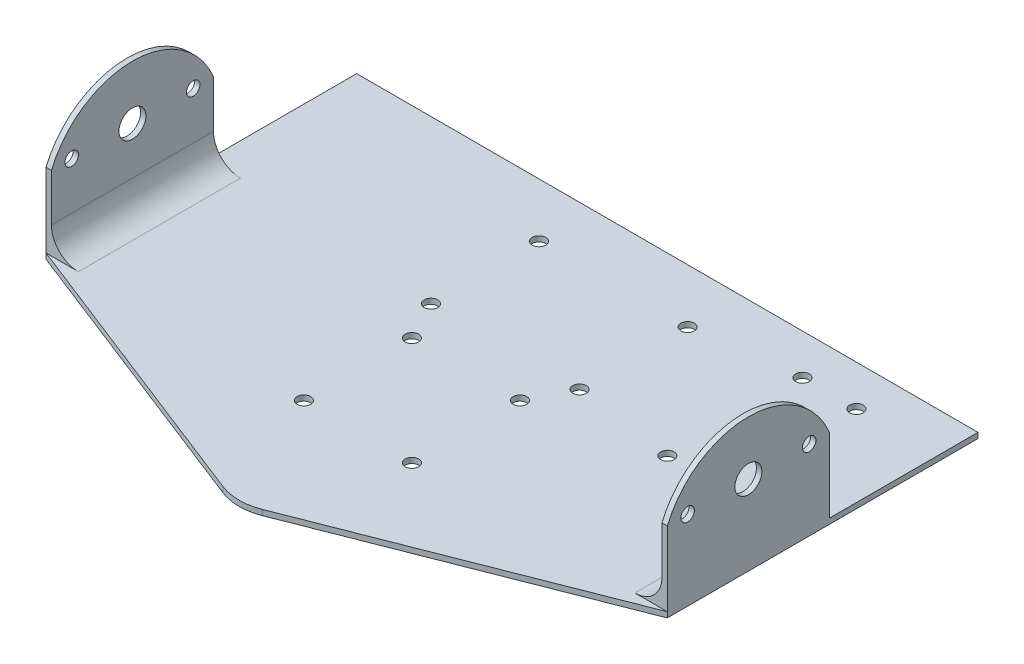
ISO-10303-21;
HEADER;
FILE_DESCRIPTION(('STEP AP214'),'2;1');
FILE_NAME('part.step','',(''),(''),'','','');
FILE_SCHEMA(('AUTOMOTIVE_DESIGN { 1 0 10303 214 1 1 1 1 }'));
ENDSEC;
DATA;
#1=APPLICATION_CONTEXT('core data for automotive mechanical design processes');
#2=APPLICATION_PROTOCOL_DEFINITION('international standard','automotive_design',2000,#1);
#3=PRODUCT_CONTEXT('',#1,'mechanical');
#4=PRODUCT('Part','Part','',(#3));
#5=PRODUCT_RELATED_PRODUCT_CATEGORY('part','',(#4));
#6=PRODUCT_DEFINITION_FORMATION('','',#4);
#7=PRODUCT_DEFINITION_CONTEXT('part definition',#1,'design');
#8=PRODUCT_DEFINITION('design','',#6,#7);
#9=PRODUCT_DEFINITION_SHAPE('','',#8);
#10=(LENGTH_UNIT() NAMED_UNIT(*) SI_UNIT(.MILLI.,.METRE.));
#11=(NAMED_UNIT(*) PLANE_ANGLE_UNIT() SI_UNIT($,.RADIAN.));
#12=(NAMED_UNIT(*) SI_UNIT($,.STERADIAN.) SOLID_ANGLE_UNIT());
#13=UNCERTAINTY_MEASURE_WITH_UNIT(LENGTH_MEASURE(1.E-05),#10,'distance_accuracy_value','');
#14=(GEOMETRIC_REPRESENTATION_CONTEXT(3) GLOBAL_UNCERTAINTY_ASSIGNED_CONTEXT((#13)) GLOBAL_UNIT_ASSIGNED_CONTEXT((#10,
#11,#12)) REPRESENTATION_CONTEXT('',''));
#15=CARTESIAN_POINT('',(0.,0.,0.));
#16=DIRECTION('',(0.,0.,1.));
#17=DIRECTION('',(1.,0.,0.));
#18=AXIS2_PLACEMENT_3D('',#15,#16,#17);
#19=CARTESIAN_POINT('',(0.,2.,0.));
#20=DIRECTION('',(0.,-1.,0.));
#21=DIRECTION('',(0.,0.,-1.));
#22=AXIS2_PLACEMENT_3D('',#19,#20,#21);
#23=PLANE('',#22);
#24=CARTESIAN_POINT('',(-27.5,2.,-25.));
#25=DIRECTION('',(0.,1.,0.));
#26=DIRECTION('',(0.,0.,1.));
#27=AXIS2_PLACEMENT_3D('',#24,#25,#26);
#28=CIRCLE('',#27,2.5);
#29=CARTESIAN_POINT('',(-27.5,2.,-22.5));
#30=VERTEX_POINT('',#29);
#31=EDGE_CURVE('E261',#30,#30,#28,.T.);
#32=ORIENTED_EDGE('',*,*,#31,.F.);
#33=EDGE_LOOP('',(#32));
#34=FACE_BOUND('',#33,.T.);
#35=CARTESIAN_POINT('',(-27.5,2.,-65.));
#36=DIRECTION('',(0.,1.,0.));
#37=DIRECTION('',(0.,0.,1.));
#38=AXIS2_PLACEMENT_3D('',#35,#36,#37);
#39=CIRCLE('',#38,2.5);
#40=CARTESIAN_POINT('',(-27.5,2.,-62.5));
#41=VERTEX_POINT('',#40);
#42=EDGE_CURVE('E257',#41,#41,#39,.T.);
#43=ORIENTED_EDGE('',*,*,#42,.F.);
#44=EDGE_LOOP('',(#43));
#45=FACE_BOUND('',#44,.T.);
#46=CARTESIAN_POINT('',(27.5,2.,-65.));
#47=DIRECTION('',(0.,1.,0.));
#48=DIRECTION('',(0.,0.,1.));
#49=AXIS2_PLACEMENT_3D('',#46,#47,#48);
#50=CIRCLE('',#49,2.5);
#51=CARTESIAN_POINT('',(27.5,2.,-62.5));
#52=VERTEX_POINT('',#51);
#53=EDGE_CURVE('E253',#52,#52,#50,.T.);
#54=ORIENTED_EDGE('',*,*,#53,.F.);
#55=EDGE_LOOP('',(#54));
#56=FACE_BOUND('',#55,.T.);
#57=CARTESIAN_POINT('',(27.5,2.,-25.));
#58=DIRECTION('',(0.,1.,0.));
#59=DIRECTION('',(0.,0.,1.));
#60=AXIS2_PLACEMENT_3D('',#57,#58,#59);
#61=CIRCLE('',#60,2.5);
#62=CARTESIAN_POINT('',(27.5,2.,-22.5));
#63=VERTEX_POINT('',#62);
#64=EDGE_CURVE('E249',#63,#63,#61,.T.);
#65=ORIENTED_EDGE('',*,*,#64,.F.);
#66=EDGE_LOOP('',(#65));
#67=FACE_BOUND('',#66,.T.);
#68=CARTESIAN_POINT('',(85.,2.,-70.));
#69=DIRECTION('',(0.,1.,0.));
#70=DIRECTION('',(0.,0.,1.));
#71=AXIS2_PLACEMENT_3D('',#68,#69,#70);
#72=CIRCLE('',#71,2.50000000000001);
#73=CARTESIAN_POINT('',(85.,2.,-67.5));
#74=VERTEX_POINT('',#73);
#75=EDGE_CURVE('E245',#74,#74,#72,.T.);
#76=ORIENTED_EDGE('',*,*,#75,.F.);
#77=EDGE_LOOP('',(#76));
#78=FACE_BOUND('',#77,.T.);
#79=CARTESIAN_POINT('',(65.,2.,-70.));
#80=DIRECTION('',(0.,1.,0.));
#81=DIRECTION('',(0.,0.,1.));
#82=AXIS2_PLACEMENT_3D('',#79,#80,#81);
#83=CIRCLE('',#82,2.5);
#84=CARTESIAN_POINT('',(65.,2.,-67.5));
#85=VERTEX_POINT('',#84);
#86=EDGE_CURVE('E241',#85,#85,#83,.T.);
#87=ORIENTED_EDGE('',*,*,#86,.F.);
#88=EDGE_LOOP('',(#87));
#89=FACE_BOUND('',#88,.T.);
#90=CARTESIAN_POINT('',(65.,2.,-20.));
#91=DIRECTION('',(0.,1.,0.));
#92=DIRECTION('',(0.,0.,-1.));
#93=AXIS2_PLACEMENT_3D('',#90,#91,#92);
#94=CIRCLE('',#93,2.5);
#95=CARTESIAN_POINT('',(65.,2.,-22.5));
#96=VERTEX_POINT('',#95);
#97=EDGE_CURVE('E237',#96,#96,#94,.T.);
#98=ORIENTED_EDGE('',*,*,#97,.F.);
#99=EDGE_LOOP('',(#98));
#100=FACE_BOUND('',#99,.T.);
#101=CARTESIAN_POINT('',(85.,2.,-20.));
#102=DIRECTION('',(0.,1.,0.));
#103=DIRECTION('',(0.,0.,-1.));
#104=AXIS2_PLACEMENT_3D('',#101,#102,#103);
#105=CIRCLE('',#104,2.50000000000001);
#106=CARTESIAN_POINT('',(85.,2.,-22.5));
#107=VERTEX_POINT('',#106);
#108=EDGE_CURVE('E233',#107,#107,#105,.T.);
#109=ORIENTED_EDGE('',*,*,#108,.F.);
#110=EDGE_LOOP('',(#109));
#111=FACE_BOUND('',#110,.T.);
#112=CARTESIAN_POINT('',(-20.,2.,-10.45));
#113=DIRECTION('',(0.,1.,0.));
#114=DIRECTION('',(0.,0.,1.));
#115=AXIS2_PLACEMENT_3D('',#112,#113,#114);
#116=CIRCLE('',#115,2.5);
#117=CARTESIAN_POINT('',(-20.,2.,-7.95000000000003));
#118=VERTEX_POINT('',#117);
#119=EDGE_CURVE('E229',#118,#118,#116,.T.);
#120=ORIENTED_EDGE('',*,*,#119,.F.);
#121=EDGE_LOOP('',(#120));
#122=FACE_BOUND('',#121,.T.);
#123=CARTESIAN_POINT('',(20.,2.,-10.45));
#124=DIRECTION('',(0.,1.,0.));
#125=DIRECTION('',(0.,0.,1.));
#126=AXIS2_PLACEMENT_3D('',#123,#124,#125);
#127=CIRCLE('',#126,2.5);
#128=CARTESIAN_POINT('',(20.,2.,-7.95000000000003));
#129=VERTEX_POINT('',#128);
#130=EDGE_CURVE('E225',#129,#129,#127,.T.);
#131=ORIENTED_EDGE('',*,*,#130,.F.);
#132=EDGE_LOOP('',(#131));
#133=FACE_BOUND('',#132,.T.);
#134=CARTESIAN_POINT('',(-20.,2.,29.55));
#135=DIRECTION('',(0.,1.,0.));
#136=DIRECTION('',(0.,0.,1.));
#137=AXIS2_PLACEMENT_3D('',#134,#135,#136);
#138=CIRCLE('',#137,2.5);
#139=CARTESIAN_POINT('',(-20.,2.,32.05));
#140=VERTEX_POINT('',#139);
#141=EDGE_CURVE('E221',#140,#140,#138,.T.);
#142=ORIENTED_EDGE('',*,*,#141,.F.);
#143=EDGE_LOOP('',(#142));
#144=FACE_BOUND('',#143,.T.);
#145=CARTESIAN_POINT('',(20.,2.,29.55));
#146=DIRECTION('',(0.,1.,0.));
#147=DIRECTION('',(0.,0.,-1.));
#148=AXIS2_PLACEMENT_3D('',#145,#146,#147);
#149=CIRCLE('',#148,2.5);
#150=CARTESIAN_POINT('',(20.,2.,27.05));
#151=VERTEX_POINT('',#150);
#152=EDGE_CURVE('E217',#151,#151,#149,.T.);
#153=ORIENTED_EDGE('',*,*,#152,.F.);
#154=EDGE_LOOP('',(#153));
#155=FACE_BOUND('',#154,.T.);
#156=DIRECTION('',(1.,0.,0.));
#157=VECTOR('',#156,1.);
#158=CARTESIAN_POINT('',(113.,2.,30.));
#159=LINE('',#158,#157);
#160=CARTESIAN_POINT('',(103.,2.,30.0000000000001));
#161=VERTEX_POINT('',#160);
#162=CARTESIAN_POINT('',(115.,2.,30.));
#163=VERTEX_POINT('',#162);
#164=EDGE_CURVE('E153',#161,#163,#159,.T.);
#165=ORIENTED_EDGE('',*,*,#164,.F.);
#166=DIRECTION('',(0.,0.,-1.));
#167=VECTOR('',#166,1.);
#168=CARTESIAN_POINT('',(103.,2.,30.0000000000001));
#169=LINE('',#168,#167);
#170=CARTESIAN_POINT('',(103.,2.,-30.));
#171=VERTEX_POINT('',#170);
#172=EDGE_CURVE('E159',#161,#171,#169,.T.);
#173=ORIENTED_EDGE('',*,*,#172,.T.);
#174=DIRECTION('',(-1.,0.,0.));
#175=VECTOR('',#174,1.);
#176=CARTESIAN_POINT('',(113.,2.,-30.));
#177=LINE('',#176,#175);
#178=CARTESIAN_POINT('',(115.,2.,-30.));
#179=VERTEX_POINT('',#178);
#180=EDGE_CURVE('E141',#179,#171,#177,.T.);
#181=ORIENTED_EDGE('',*,*,#180,.F.);
#182=DIRECTION('',(0.,0.,-1.));
#183=VECTOR('',#182,1.);
#184=CARTESIAN_POINT('',(115.,2.,50.));
#185=LINE('',#184,#183);
#186=CARTESIAN_POINT('',(115.,2.,-85.));
#187=VERTEX_POINT('',#186);
#188=EDGE_CURVE('E376',#179,#187,#185,.T.);
#189=ORIENTED_EDGE('',*,*,#188,.T.);
#190=DIRECTION('',(-1.,0.,0.));
#191=VECTOR('',#190,1.);
#192=CARTESIAN_POINT('',(0.,2.,-85.));
#193=LINE('',#192,#191);
#194=CARTESIAN_POINT('',(-115.,2.,-84.9999999999999));
#195=VERTEX_POINT('',#194);
#196=EDGE_CURVE('E213',#187,#195,#193,.T.);
#197=ORIENTED_EDGE('',*,*,#196,.T.);
#198=DIRECTION('',(0.,0.,1.));
#199=VECTOR('',#198,1.);
#200=CARTESIAN_POINT('',(-115.,2.,75.));
#201=LINE('',#200,#199);
#202=CARTESIAN_POINT('',(-115.,2.,-30.));
#203=VERTEX_POINT('',#202);
#204=EDGE_CURVE('E370',#195,#203,#201,.T.);
#205=ORIENTED_EDGE('',*,*,#204,.T.);
#206=DIRECTION('',(-1.,0.,0.));
#207=VECTOR('',#206,1.);
#208=CARTESIAN_POINT('',(-113.,2.,-30.));
#209=LINE('',#208,#207);
#210=CARTESIAN_POINT('',(-103.,2.,-30.));
#211=VERTEX_POINT('',#210);
#212=EDGE_CURVE('E55',#211,#203,#209,.T.);
#213=ORIENTED_EDGE('',*,*,#212,.F.);
#214=DIRECTION('',(0.,0.,-1.));
#215=VECTOR('',#214,1.);
#216=CARTESIAN_POINT('',(-103.,1.99999999999878,30.0000000000001));
#217=LINE('',#216,#215);
#218=CARTESIAN_POINT('',(-103.,1.99999999999939,30.0000000000001));
#219=VERTEX_POINT('',#218);
#220=EDGE_CURVE('E175',#219,#211,#217,.T.);
#221=ORIENTED_EDGE('',*,*,#220,.F.);
#222=DIRECTION('',(1.,0.,0.));
#223=VECTOR('',#222,1.);
#224=CARTESIAN_POINT('',(-113.,2.,30.));
#225=LINE('',#224,#223);
#226=CARTESIAN_POINT('',(-115.,2.,30.0000000000001));
#227=VERTEX_POINT('',#226);
#228=EDGE_CURVE('E48',#227,#219,#225,.T.);
#229=ORIENTED_EDGE('',*,*,#228,.F.);
#230=DIRECTION('',(0.931242779705754,0.,0.364399348580512));
#231=VECTOR('',#230,1.);
#232=CARTESIAN_POINT('',(-25.4508196721311,2.,65.0409836065574));
#233=LINE('',#232,#231);
#234=CARTESIAN_POINT('',(-7.28798697161031,2.,72.148179011109));
#235=VERTEX_POINT('',#234);
#236=EDGE_CURVE('E198',#227,#235,#233,.T.);
#237=ORIENTED_EDGE('',*,*,#236,.T.);
#238=CARTESIAN_POINT('',(0.,2.,53.523323416994));
#239=DIRECTION('',(0.,-1.,0.));
#240=DIRECTION('',(0.,0.,-1.));
#241=AXIS2_PLACEMENT_3D('',#238,#239,#240);
#242=CIRCLE('',#241,20.);
#243=CARTESIAN_POINT('',(7.2879869716103,2.,72.148179011109));
#244=VERTEX_POINT('',#243);
#245=EDGE_CURVE('E207',#235,#244,#242,.F.);
#246=ORIENTED_EDGE('',*,*,#245,.T.);
#247=DIRECTION('',(0.931242779705754,0.,-0.364399348580512));
#248=VECTOR('',#247,1.);
#249=CARTESIAN_POINT('',(25.4508196721311,2.,65.0409836065574));
#250=LINE('',#249,#248);
#251=EDGE_CURVE('E205',#244,#163,#250,.T.);
#252=ORIENTED_EDGE('',*,*,#251,.T.);
#253=EDGE_LOOP('',(#165,#173,#181,#189,#197,#205,#213,#221,#229,#237,#246,#252));
#254=FACE_BOUND('',#253,.T.);
#255=ADVANCED_FACE('F33',(#34,#45,#56,#67,#78,#89,#100,#111,#122,#133,#144,#155,#254),#23,.F.);
#256=CARTESIAN_POINT('',(113.,57.,30.));
#257=DIRECTION('',(1.,0.,0.));
#258=DIRECTION('',(0.,0.,-1.));
#259=AXIS2_PLACEMENT_3D('',#256,#257,#258);
#260=PLANE('',#259);
#261=CARTESIAN_POINT('',(113.,29.5,0.));
#262=DIRECTION('',(1.,0.,0.));
#263=DIRECTION('',(0.,0.,-1.));
#264=AXIS2_PLACEMENT_3D('',#261,#262,#263);
#265=CIRCLE('',#264,5.);
#266=CARTESIAN_POINT('',(113.,29.5,-5.00000000000002));
#267=VERTEX_POINT('',#266);
#268=EDGE_CURVE('E306',#267,#267,#265,.T.);
#269=ORIENTED_EDGE('',*,*,#268,.T.);
#270=EDGE_LOOP('',(#269));
#271=FACE_BOUND('',#270,.T.);
#272=CARTESIAN_POINT('',(113.,29.5,-22.5));
#273=DIRECTION('',(1.,0.,0.));
#274=DIRECTION('',(0.,0.,-1.));
#275=AXIS2_PLACEMENT_3D('',#272,#273,#274);
#276=CIRCLE('',#275,2.5);
#277=CARTESIAN_POINT('',(113.,29.5,-25.));
#278=VERTEX_POINT('',#277);
#279=EDGE_CURVE('E296',#278,#278,#276,.T.);
#280=ORIENTED_EDGE('',*,*,#279,.T.);
#281=EDGE_LOOP('',(#280));
#282=FACE_BOUND('',#281,.T.);
#283=CARTESIAN_POINT('',(113.,29.5,22.5));
#284=DIRECTION('',(1.,0.,0.));
#285=DIRECTION('',(0.,0.,-1.));
#286=AXIS2_PLACEMENT_3D('',#283,#284,#285);
#287=CIRCLE('',#286,2.5);
#288=CARTESIAN_POINT('',(113.,29.5,20.));
#289=VERTEX_POINT('',#288);
#290=EDGE_CURVE('E286',#289,#289,#287,.T.);
#291=ORIENTED_EDGE('',*,*,#290,.T.);
#292=EDGE_LOOP('',(#291));
#293=FACE_BOUND('',#292,.T.);
#294=DIRECTION('',(0.,0.,-1.));
#295=VECTOR('',#294,1.);
#296=CARTESIAN_POINT('',(113.,12.0000000000001,30.0000000000001));
#297=LINE('',#296,#295);
#298=CARTESIAN_POINT('',(113.,12.0000000000001,30.0000000000001));
#299=VERTEX_POINT('',#298);
#300=CARTESIAN_POINT('',(113.,12.0000000000001,-30.));
#301=VERTEX_POINT('',#300);
#302=EDGE_CURVE('E161',#299,#301,#297,.T.);
#303=ORIENTED_EDGE('',*,*,#302,.F.);
#304=DIRECTION('',(0.,-1.,0.));
#305=VECTOR('',#304,1.);
#306=CARTESIAN_POINT('',(113.,57.,30.));
#307=LINE('',#306,#305);
#308=CARTESIAN_POINT('',(113.,29.5,30.));
#309=VERTEX_POINT('',#308);
#310=EDGE_CURVE('E317',#309,#299,#307,.T.);
#311=ORIENTED_EDGE('',*,*,#310,.F.);
#312=CARTESIAN_POINT('',(113.,17.,0.));
#313=DIRECTION('',(1.,0.,0.));
#314=DIRECTION('',(0.,0.,-1.));
#315=AXIS2_PLACEMENT_3D('',#312,#313,#314);
#316=CIRCLE('',#315,32.5);
#317=CARTESIAN_POINT('',(113.,29.5,-30.));
#318=VERTEX_POINT('',#317);
#319=EDGE_CURVE('E268',#309,#318,#316,.F.);
#320=ORIENTED_EDGE('',*,*,#319,.T.);
#321=DIRECTION('',(0.,-1.,0.));
#322=VECTOR('',#321,1.);
#323=CARTESIAN_POINT('',(113.,57.,-30.));
#324=LINE('',#323,#322);
#325=EDGE_CURVE('E320',#318,#301,#324,.T.);
#326=ORIENTED_EDGE('',*,*,#325,.T.);
#327=EDGE_LOOP('',(#303,#311,#320,#326));
#328=FACE_BOUND('',#327,.T.);
#329=ADVANCED_FACE('F395',(#271,#282,#293,#328),#260,.F.);
#330=CARTESIAN_POINT('',(-113.,57.,30.));
#331=DIRECTION('',(-1.,0.,0.));
#332=DIRECTION('',(0.,0.,1.));
#333=AXIS2_PLACEMENT_3D('',#330,#331,#332);
#334=PLANE('',#333);
#335=CARTESIAN_POINT('',(-113.,29.5,0.));
#336=DIRECTION('',(-1.,0.,0.));
#337=DIRECTION('',(0.,0.,1.));
#338=AXIS2_PLACEMENT_3D('',#335,#336,#337);
#339=CIRCLE('',#338,5.);
#340=CARTESIAN_POINT('',(-113.,29.5,5.00000000000002));
#341=VERTEX_POINT('',#340);
#342=EDGE_CURVE('E307',#341,#341,#339,.T.);
#343=ORIENTED_EDGE('',*,*,#342,.T.);
#344=EDGE_LOOP('',(#343));
#345=FACE_BOUND('',#344,.T.);
#346=CARTESIAN_POINT('',(-113.,29.5,-22.5));
#347=DIRECTION('',(-1.,0.,0.));
#348=DIRECTION('',(0.,0.,1.));
#349=AXIS2_PLACEMENT_3D('',#346,#347,#348);
#350=CIRCLE('',#349,2.5);
#351=CARTESIAN_POINT('',(-113.,29.5,-20.));
#352=VERTEX_POINT('',#351);
#353=EDGE_CURVE('E297',#352,#352,#350,.T.);
#354=ORIENTED_EDGE('',*,*,#353,.T.);
#355=EDGE_LOOP('',(#354));
#356=FACE_BOUND('',#355,.T.);
#357=CARTESIAN_POINT('',(-113.,29.5,22.5));
#358=DIRECTION('',(-1.,0.,0.));
#359=DIRECTION('',(0.,0.,1.));
#360=AXIS2_PLACEMENT_3D('',#357,#358,#359);
#361=CIRCLE('',#360,2.5);
#362=CARTESIAN_POINT('',(-113.,29.5,25.));
#363=VERTEX_POINT('',#362);
#364=EDGE_CURVE('E287',#363,#363,#361,.T.);
#365=ORIENTED_EDGE('',*,*,#364,.T.);
#366=EDGE_LOOP('',(#365));
#367=FACE_BOUND('',#366,.T.);
#368=DIRECTION('',(0.,0.,-1.));
#369=VECTOR('',#368,1.);
#370=CARTESIAN_POINT('',(-113.,11.9999999999987,30.0000000000001));
#371=LINE('',#370,#369);
#372=CARTESIAN_POINT('',(-113.,11.9999999999987,30.));
#373=VERTEX_POINT('',#372);
#374=CARTESIAN_POINT('',(-113.,11.9999999999987,-30.));
#375=VERTEX_POINT('',#374);
#376=EDGE_CURVE('E178',#373,#375,#371,.T.);
#377=ORIENTED_EDGE('',*,*,#376,.T.);
#378=DIRECTION('',(0.,-1.,0.));
#379=VECTOR('',#378,1.);
#380=CARTESIAN_POINT('',(-113.,57.,-30.));
#381=LINE('',#380,#379);
#382=CARTESIAN_POINT('',(-113.,29.5,-30.));
#383=VERTEX_POINT('',#382);
#384=EDGE_CURVE('E339',#383,#375,#381,.T.);
#385=ORIENTED_EDGE('',*,*,#384,.F.);
#386=CARTESIAN_POINT('',(-113.,17.,0.));
#387=DIRECTION('',(-1.,0.,0.));
#388=DIRECTION('',(0.,0.,1.));
#389=AXIS2_PLACEMENT_3D('',#386,#387,#388);
#390=CIRCLE('',#389,32.5);
#391=CARTESIAN_POINT('',(-113.,29.5,30.));
#392=VERTEX_POINT('',#391);
#393=EDGE_CURVE('E274',#383,#392,#390,.F.);
#394=ORIENTED_EDGE('',*,*,#393,.T.);
#395=DIRECTION('',(0.,-1.,0.));
#396=VECTOR('',#395,1.);
#397=CARTESIAN_POINT('',(-113.,57.,30.));
#398=LINE('',#397,#396);
#399=EDGE_CURVE('E324',#392,#373,#398,.T.);
#400=ORIENTED_EDGE('',*,*,#399,.T.);
#401=EDGE_LOOP('',(#377,#385,#394,#400));
#402=FACE_BOUND('',#401,.T.);
#403=ADVANCED_FACE('F409',(#345,#356,#367,#402),#334,.F.);
#404=CARTESIAN_POINT('',(115.,2.,-50.));
#405=DIRECTION('',(-1.,0.,0.));
#406=DIRECTION('',(0.,0.,1.));
#407=AXIS2_PLACEMENT_3D('',#404,#405,#406);
#408=PLANE('',#407);
#409=CARTESIAN_POINT('',(115.,29.5,22.5));
#410=DIRECTION('',(-1.,0.,0.));
#411=DIRECTION('',(0.,0.,1.));
#412=AXIS2_PLACEMENT_3D('',#409,#410,#411);
#413=CIRCLE('',#412,2.5);
#414=CARTESIAN_POINT('',(115.,29.5,25.));
#415=VERTEX_POINT('',#414);
#416=EDGE_CURVE('E290',#415,#415,#413,.T.);
#417=ORIENTED_EDGE('',*,*,#416,.T.);
#418=EDGE_LOOP('',(#417));
#419=FACE_BOUND('',#418,.T.);
#420=CARTESIAN_POINT('',(115.,29.5,-22.5));
#421=DIRECTION('',(-1.,0.,0.));
#422=DIRECTION('',(0.,0.,1.));
#423=AXIS2_PLACEMENT_3D('',#420,#421,#422);
#424=CIRCLE('',#423,2.5);
#425=CARTESIAN_POINT('',(115.,29.5,-20.));
#426=VERTEX_POINT('',#425);
#427=EDGE_CURVE('E300',#426,#426,#424,.T.);
#428=ORIENTED_EDGE('',*,*,#427,.T.);
#429=EDGE_LOOP('',(#428));
#430=FACE_BOUND('',#429,.T.);
#431=CARTESIAN_POINT('',(115.,29.5,0.));
#432=DIRECTION('',(-1.,0.,0.));
#433=DIRECTION('',(0.,0.,1.));
#434=AXIS2_PLACEMENT_3D('',#431,#432,#433);
#435=CIRCLE('',#434,5.);
#436=CARTESIAN_POINT('',(115.,29.5,4.99999999999999));
#437=VERTEX_POINT('',#436);
#438=EDGE_CURVE('E154',#437,#437,#435,.T.);
#439=ORIENTED_EDGE('',*,*,#438,.T.);
#440=EDGE_LOOP('',(#439));
#441=FACE_BOUND('',#440,.T.);
#442=DIRECTION('',(0.,-1.,0.));
#443=VECTOR('',#442,1.);
#444=CARTESIAN_POINT('',(115.,57.,30.));
#445=LINE('',#444,#443);
#446=CARTESIAN_POINT('',(115.,29.5,30.));
#447=VERTEX_POINT('',#446);
#448=EDGE_CURVE('E314',#447,#163,#445,.T.);
#449=ORIENTED_EDGE('',*,*,#448,.T.);
#450=DIRECTION('',(0.,-1.,0.));
#451=VECTOR('',#450,1.);
#452=CARTESIAN_POINT('',(115.,357.647053358393,30.));
#453=LINE('',#452,#451);
#454=CARTESIAN_POINT('',(115.,1.11022302462516E-13,30.));
#455=VERTEX_POINT('',#454);
#456=EDGE_CURVE('E182',#163,#455,#453,.T.);
#457=ORIENTED_EDGE('',*,*,#456,.T.);
#458=DIRECTION('',(0.,0.,-1.));
#459=VECTOR('',#458,1.);
#460=CARTESIAN_POINT('',(115.,0.,-50.));
#461=LINE('',#460,#459);
#462=CARTESIAN_POINT('',(115.,0.,-85.));
#463=VERTEX_POINT('',#462);
#464=EDGE_CURVE('E371',#455,#463,#461,.T.);
#465=ORIENTED_EDGE('',*,*,#464,.T.);
#466=DIRECTION('',(0.,-1.,0.));
#467=VECTOR('',#466,1.);
#468=CARTESIAN_POINT('',(115.,396.800799701989,-85.));
#469=LINE('',#468,#467);
#470=EDGE_CURVE('E209',#187,#463,#469,.T.);
#471=ORIENTED_EDGE('',*,*,#470,.F.);
#472=ORIENTED_EDGE('',*,*,#188,.F.);
#473=DIRECTION('',(0.,-1.,0.));
#474=VECTOR('',#473,1.);
#475=CARTESIAN_POINT('',(115.,57.,-30.));
#476=LINE('',#475,#474);
#477=CARTESIAN_POINT('',(115.,29.5,-30.));
#478=VERTEX_POINT('',#477);
#479=EDGE_CURVE('E149',#478,#179,#476,.T.);
#480=ORIENTED_EDGE('',*,*,#479,.F.);
#481=CARTESIAN_POINT('',(115.,17.,0.));
#482=DIRECTION('',(-1.,0.,0.));
#483=DIRECTION('',(0.,0.,1.));
#484=AXIS2_PLACEMENT_3D('',#481,#482,#483);
#485=CIRCLE('',#484,32.5);
#486=EDGE_CURVE('E280',#478,#447,#485,.F.);
#487=ORIENTED_EDGE('',*,*,#486,.T.);
#488=EDGE_LOOP('',(#449,#457,#465,#471,#472,#480,#487));
#489=FACE_BOUND('',#488,.T.);
#490=ADVANCED_FACE('F35',(#419,#430,#441,#489),#408,.F.);
#491=CARTESIAN_POINT('',(-115.,2.,-50.));
#492=DIRECTION('',(1.,0.,0.));
#493=DIRECTION('',(0.,0.,-1.));
#494=AXIS2_PLACEMENT_3D('',#491,#492,#493);
#495=PLANE('',#494);
#496=CARTESIAN_POINT('',(-115.,29.5,22.5));
#497=DIRECTION('',(-1.,0.,0.));
#498=DIRECTION('',(0.,0.,1.));
#499=AXIS2_PLACEMENT_3D('',#496,#497,#498);
#500=CIRCLE('',#499,2.5);
#501=CARTESIAN_POINT('',(-115.,29.5,25.));
#502=VERTEX_POINT('',#501);
#503=EDGE_CURVE('E283',#502,#502,#500,.T.);
#504=ORIENTED_EDGE('',*,*,#503,.F.);
#505=EDGE_LOOP('',(#504));
#506=FACE_BOUND('',#505,.T.);
#507=CARTESIAN_POINT('',(-115.,29.5,-22.5));
#508=DIRECTION('',(-1.,0.,0.));
#509=DIRECTION('',(0.,0.,1.));
#510=AXIS2_PLACEMENT_3D('',#507,#508,#509);
#511=CIRCLE('',#510,2.5);
#512=CARTESIAN_POINT('',(-115.,29.5,-20.));
#513=VERTEX_POINT('',#512);
#514=EDGE_CURVE('E293',#513,#513,#511,.T.);
#515=ORIENTED_EDGE('',*,*,#514,.F.);
#516=EDGE_LOOP('',(#515));
#517=FACE_BOUND('',#516,.T.);
#518=CARTESIAN_POINT('',(-115.,29.5,0.));
#519=DIRECTION('',(-1.,0.,0.));
#520=DIRECTION('',(0.,0.,1.));
#521=AXIS2_PLACEMENT_3D('',#518,#519,#520);
#522=CIRCLE('',#521,5.);
#523=CARTESIAN_POINT('',(-115.,29.5,5.00000000000002));
#524=VERTEX_POINT('',#523);
#525=EDGE_CURVE('E303',#524,#524,#522,.T.);
#526=ORIENTED_EDGE('',*,*,#525,.F.);
#527=EDGE_LOOP('',(#526));
#528=FACE_BOUND('',#527,.T.);
#529=DIRECTION('',(0.,0.,1.));
#530=VECTOR('',#529,1.);
#531=CARTESIAN_POINT('',(-115.,0.,-50.));
#532=LINE('',#531,#530);
#533=CARTESIAN_POINT('',(-115.,0.,-85.));
#534=VERTEX_POINT('',#533);
#535=CARTESIAN_POINT('',(-115.,0.,30.));
#536=VERTEX_POINT('',#535);
#537=EDGE_CURVE('E367',#534,#536,#532,.T.);
#538=ORIENTED_EDGE('',*,*,#537,.T.);
#539=DIRECTION('',(0.,-1.,0.));
#540=VECTOR('',#539,1.);
#541=CARTESIAN_POINT('',(-115.,357.647053358393,30.));
#542=LINE('',#541,#540);
#543=EDGE_CURVE('E190',#227,#536,#542,.T.);
#544=ORIENTED_EDGE('',*,*,#543,.F.);
#545=DIRECTION('',(0.,-1.,0.));
#546=VECTOR('',#545,1.);
#547=CARTESIAN_POINT('',(-115.,57.,30.));
#548=LINE('',#547,#546);
#549=CARTESIAN_POINT('',(-115.,29.5,30.));
#550=VERTEX_POINT('',#549);
#551=EDGE_CURVE('E340',#550,#227,#548,.T.);
#552=ORIENTED_EDGE('',*,*,#551,.F.);
#553=CARTESIAN_POINT('',(-115.,17.,0.));
#554=DIRECTION('',(1.,0.,0.));
#555=DIRECTION('',(0.,0.,-1.));
#556=AXIS2_PLACEMENT_3D('',#553,#554,#555);
#557=CIRCLE('',#556,32.5);
#558=CARTESIAN_POINT('',(-115.,29.5,-30.));
#559=VERTEX_POINT('',#558);
#560=EDGE_CURVE('E277',#550,#559,#557,.F.);
#561=ORIENTED_EDGE('',*,*,#560,.T.);
#562=DIRECTION('',(0.,-1.,0.));
#563=VECTOR('',#562,1.);
#564=CARTESIAN_POINT('',(-115.,57.,-30.));
#565=LINE('',#564,#563);
#566=EDGE_CURVE('E335',#559,#203,#565,.T.);
#567=ORIENTED_EDGE('',*,*,#566,.T.);
#568=ORIENTED_EDGE('',*,*,#204,.F.);
#569=DIRECTION('',(0.,-1.,0.));
#570=VECTOR('',#569,1.);
#571=CARTESIAN_POINT('',(-115.,396.800799701989,-85.));
#572=LINE('',#571,#570);
#573=EDGE_CURVE('E210',#195,#534,#572,.T.);
#574=ORIENTED_EDGE('',*,*,#573,.T.);
#575=EDGE_LOOP('',(#538,#544,#552,#561,#567,#568,#574));
#576=FACE_BOUND('',#575,.T.);
#577=ADVANCED_FACE('F408',(#506,#517,#528,#576),#495,.F.);
#578=CARTESIAN_POINT('',(0.,0.,0.));
#579=DIRECTION('',(0.,-1.,0.));
#580=DIRECTION('',(0.,0.,-1.));
#581=AXIS2_PLACEMENT_3D('',#578,#579,#580);
#582=PLANE('',#581);
#583=DIRECTION('',(0.931242779705754,0.,0.364399348580512));
#584=VECTOR('',#583,1.);
#585=CARTESIAN_POINT('',(-25.4508196721311,0.,65.0409836065574));
#586=LINE('',#585,#584);
#587=CARTESIAN_POINT('',(-7.28798697161031,0.,72.148179011109));
#588=VERTEX_POINT('',#587);
#589=EDGE_CURVE('E195',#536,#588,#586,.T.);
#590=ORIENTED_EDGE('',*,*,#589,.F.);
#591=ORIENTED_EDGE('',*,*,#537,.F.);
#592=DIRECTION('',(-1.,0.,0.));
#593=VECTOR('',#592,1.);
#594=CARTESIAN_POINT('',(0.,0.,-85.));
#595=LINE('',#594,#593);
#596=EDGE_CURVE('E41',#463,#534,#595,.T.);
#597=ORIENTED_EDGE('',*,*,#596,.F.);
#598=ORIENTED_EDGE('',*,*,#464,.F.);
#599=DIRECTION('',(0.931242779705754,0.,-0.364399348580512));
#600=VECTOR('',#599,1.);
#601=CARTESIAN_POINT('',(25.4508196721311,0.,65.0409836065574));
#602=LINE('',#601,#600);
#603=CARTESIAN_POINT('',(7.2879869716103,0.,72.148179011109));
#604=VERTEX_POINT('',#603);
#605=EDGE_CURVE('E200',#604,#455,#602,.T.);
#606=ORIENTED_EDGE('',*,*,#605,.F.);
#607=CARTESIAN_POINT('',(0.,0.,53.523323416994));
#608=DIRECTION('',(0.,-1.,0.));
#609=DIRECTION('',(0.,0.,-1.));
#610=AXIS2_PLACEMENT_3D('',#607,#608,#609);
#611=CIRCLE('',#610,20.);
#612=EDGE_CURVE('E11',#588,#604,#611,.F.);
#613=ORIENTED_EDGE('',*,*,#612,.F.);
#614=EDGE_LOOP('',(#590,#591,#597,#598,#606,#613));
#615=FACE_BOUND('',#614,.T.);
#616=CARTESIAN_POINT('',(20.,0.,29.55));
#617=DIRECTION('',(0.,-1.,0.));
#618=DIRECTION('',(0.,0.,-1.));
#619=AXIS2_PLACEMENT_3D('',#616,#617,#618);
#620=CIRCLE('',#619,2.5);
#621=CARTESIAN_POINT('',(20.,0.,27.05));
#622=VERTEX_POINT('',#621);
#623=EDGE_CURVE('E220',#622,#622,#620,.T.);
#624=ORIENTED_EDGE('',*,*,#623,.F.);
#625=EDGE_LOOP('',(#624));
#626=FACE_BOUND('',#625,.T.);
#627=CARTESIAN_POINT('',(-20.,0.,29.55));
#628=DIRECTION('',(0.,-1.,0.));
#629=DIRECTION('',(0.,0.,-1.));
#630=AXIS2_PLACEMENT_3D('',#627,#628,#629);
#631=CIRCLE('',#630,2.5);
#632=CARTESIAN_POINT('',(-20.,0.,27.05));
#633=VERTEX_POINT('',#632);
#634=EDGE_CURVE('E224',#633,#633,#631,.T.);
#635=ORIENTED_EDGE('',*,*,#634,.F.);
#636=EDGE_LOOP('',(#635));
#637=FACE_BOUND('',#636,.T.);
#638=CARTESIAN_POINT('',(20.,0.,-10.45));
#639=DIRECTION('',(0.,-1.,0.));
#640=DIRECTION('',(0.,0.,-1.));
#641=AXIS2_PLACEMENT_3D('',#638,#639,#640);
#642=CIRCLE('',#641,2.5);
#643=CARTESIAN_POINT('',(20.,0.,-12.95));
#644=VERTEX_POINT('',#643);
#645=EDGE_CURVE('E228',#644,#644,#642,.T.);
#646=ORIENTED_EDGE('',*,*,#645,.F.);
#647=EDGE_LOOP('',(#646));
#648=FACE_BOUND('',#647,.T.);
#649=CARTESIAN_POINT('',(-20.,0.,-10.45));
#650=DIRECTION('',(0.,-1.,0.));
#651=DIRECTION('',(0.,0.,-1.));
#652=AXIS2_PLACEMENT_3D('',#649,#650,#651);
#653=CIRCLE('',#652,2.5);
#654=CARTESIAN_POINT('',(-20.,0.,-12.95));
#655=VERTEX_POINT('',#654);
#656=EDGE_CURVE('E232',#655,#655,#653,.T.);
#657=ORIENTED_EDGE('',*,*,#656,.F.);
#658=EDGE_LOOP('',(#657));
#659=FACE_BOUND('',#658,.T.);
#660=CARTESIAN_POINT('',(85.,0.,-20.));
#661=DIRECTION('',(0.,-1.,0.));
#662=DIRECTION('',(0.,0.,-1.));
#663=AXIS2_PLACEMENT_3D('',#660,#661,#662);
#664=CIRCLE('',#663,2.50000000000001);
#665=CARTESIAN_POINT('',(85.,0.,-22.5));
#666=VERTEX_POINT('',#665);
#667=EDGE_CURVE('E236',#666,#666,#664,.T.);
#668=ORIENTED_EDGE('',*,*,#667,.F.);
#669=EDGE_LOOP('',(#668));
#670=FACE_BOUND('',#669,.T.);
#671=CARTESIAN_POINT('',(65.,0.,-20.));
#672=DIRECTION('',(0.,-1.,0.));
#673=DIRECTION('',(0.,0.,-1.));
#674=AXIS2_PLACEMENT_3D('',#671,#672,#673);
#675=CIRCLE('',#674,2.5);
#676=CARTESIAN_POINT('',(65.,0.,-22.5));
#677=VERTEX_POINT('',#676);
#678=EDGE_CURVE('E240',#677,#677,#675,.T.);
#679=ORIENTED_EDGE('',*,*,#678,.F.);
#680=EDGE_LOOP('',(#679));
#681=FACE_BOUND('',#680,.T.);
#682=CARTESIAN_POINT('',(65.,0.,-70.));
#683=DIRECTION('',(0.,-1.,0.));
#684=DIRECTION('',(0.,0.,-1.));
#685=AXIS2_PLACEMENT_3D('',#682,#683,#684);
#686=CIRCLE('',#685,2.5);
#687=CARTESIAN_POINT('',(65.,0.,-72.5));
#688=VERTEX_POINT('',#687);
#689=EDGE_CURVE('E244',#688,#688,#686,.T.);
#690=ORIENTED_EDGE('',*,*,#689,.F.);
#691=EDGE_LOOP('',(#690));
#692=FACE_BOUND('',#691,.T.);
#693=CARTESIAN_POINT('',(85.,0.,-70.));
#694=DIRECTION('',(0.,-1.,0.));
#695=DIRECTION('',(0.,0.,-1.));
#696=AXIS2_PLACEMENT_3D('',#693,#694,#695);
#697=CIRCLE('',#696,2.50000000000001);
#698=CARTESIAN_POINT('',(85.,0.,-72.5));
#699=VERTEX_POINT('',#698);
#700=EDGE_CURVE('E248',#699,#699,#697,.T.);
#701=ORIENTED_EDGE('',*,*,#700,.F.);
#702=EDGE_LOOP('',(#701));
#703=FACE_BOUND('',#702,.T.);
#704=CARTESIAN_POINT('',(27.5,0.,-25.));
#705=DIRECTION('',(0.,-1.,0.));
#706=DIRECTION('',(0.,0.,-1.));
#707=AXIS2_PLACEMENT_3D('',#704,#705,#706);
#708=CIRCLE('',#707,2.5);
#709=CARTESIAN_POINT('',(27.5,0.,-27.5));
#710=VERTEX_POINT('',#709);
#711=EDGE_CURVE('E252',#710,#710,#708,.T.);
#712=ORIENTED_EDGE('',*,*,#711,.F.);
#713=EDGE_LOOP('',(#712));
#714=FACE_BOUND('',#713,.T.);
#715=CARTESIAN_POINT('',(27.5,0.,-65.));
#716=DIRECTION('',(0.,-1.,0.));
#717=DIRECTION('',(0.,0.,-1.));
#718=AXIS2_PLACEMENT_3D('',#715,#716,#717);
#719=CIRCLE('',#718,2.5);
#720=CARTESIAN_POINT('',(27.5,0.,-67.5));
#721=VERTEX_POINT('',#720);
#722=EDGE_CURVE('E256',#721,#721,#719,.T.);
#723=ORIENTED_EDGE('',*,*,#722,.F.);
#724=EDGE_LOOP('',(#723));
#725=FACE_BOUND('',#724,.T.);
#726=CARTESIAN_POINT('',(-27.5,0.,-65.));
#727=DIRECTION('',(0.,-1.,0.));
#728=DIRECTION('',(0.,0.,-1.));
#729=AXIS2_PLACEMENT_3D('',#726,#727,#728);
#730=CIRCLE('',#729,2.5);
#731=CARTESIAN_POINT('',(-27.5,0.,-67.5));
#732=VERTEX_POINT('',#731);
#733=EDGE_CURVE('E260',#732,#732,#730,.T.);
#734=ORIENTED_EDGE('',*,*,#733,.F.);
#735=EDGE_LOOP('',(#734));
#736=FACE_BOUND('',#735,.T.);
#737=CARTESIAN_POINT('',(-27.5,0.,-25.));
#738=DIRECTION('',(0.,-1.,0.));
#739=DIRECTION('',(0.,0.,-1.));
#740=AXIS2_PLACEMENT_3D('',#737,#738,#739);
#741=CIRCLE('',#740,2.5);
#742=CARTESIAN_POINT('',(-27.5,0.,-27.5));
#743=VERTEX_POINT('',#742);
#744=EDGE_CURVE('E264',#743,#743,#741,.T.);
#745=ORIENTED_EDGE('',*,*,#744,.F.);
#746=EDGE_LOOP('',(#745));
#747=FACE_BOUND('',#746,.T.);
#748=ADVANCED_FACE('F417',(#615,#626,#637,#648,#659,#670,#681,#692,#703,#714,#725,#736,#747),
#582,.T.);
#749=CARTESIAN_POINT('',(-113.,57.,-30.));
#750=DIRECTION('',(0.,0.,1.));
#751=DIRECTION('',(1.,0.,0.));
#752=AXIS2_PLACEMENT_3D('',#749,#750,#751);
#753=PLANE('',#752);
#754=ORIENTED_EDGE('',*,*,#566,.F.);
#755=DIRECTION('',(-1.,0.,0.));
#756=VECTOR('',#755,1.);
#757=CARTESIAN_POINT('',(511.96911079062,29.5,-30.));
#758=LINE('',#757,#756);
#759=EDGE_CURVE('E270',#383,#559,#758,.T.);
#760=ORIENTED_EDGE('',*,*,#759,.F.);
#761=ORIENTED_EDGE('',*,*,#384,.T.);
#762=CARTESIAN_POINT('',(-103.,11.9999999999988,-30.));
#763=DIRECTION('',(0.,0.,1.));
#764=DIRECTION('',(1.,0.,0.));
#765=AXIS2_PLACEMENT_3D('',#762,#763,#764);
#766=CIRCLE('',#765,10.);
#767=EDGE_CURVE('E163',#375,#211,#766,.T.);
#768=ORIENTED_EDGE('',*,*,#767,.T.);
#769=ORIENTED_EDGE('',*,*,#212,.T.);
#770=EDGE_LOOP('',(#754,#760,#761,#768,#769));
#771=FACE_BOUND('',#770,.T.);
#772=ADVANCED_FACE('F439',(#771),#753,.F.);
#773=CARTESIAN_POINT('',(-113.,57.,30.));
#774=DIRECTION('',(0.,0.,-1.));
#775=DIRECTION('',(-1.,0.,0.));
#776=AXIS2_PLACEMENT_3D('',#773,#774,#775);
#777=PLANE('',#776);
#778=ORIENTED_EDGE('',*,*,#399,.F.);
#779=DIRECTION('',(-1.,0.,0.));
#780=VECTOR('',#779,1.);
#781=CARTESIAN_POINT('',(511.96911079062,29.5,30.));
#782=LINE('',#781,#780);
#783=EDGE_CURVE('E265',#392,#550,#782,.T.);
#784=ORIENTED_EDGE('',*,*,#783,.T.);
#785=ORIENTED_EDGE('',*,*,#551,.T.);
#786=ORIENTED_EDGE('',*,*,#228,.T.);
#787=CARTESIAN_POINT('',(-103.,11.9999999999988,30.0000000000001));
#788=DIRECTION('',(0.,0.,1.));
#789=DIRECTION('',(1.,0.,0.));
#790=AXIS2_PLACEMENT_3D('',#787,#788,#789);
#791=CIRCLE('',#790,10.);
#792=EDGE_CURVE('E172',#373,#219,#791,.T.);
#793=ORIENTED_EDGE('',*,*,#792,.F.);
#794=EDGE_LOOP('',(#778,#784,#785,#786,#793));
#795=FACE_BOUND('',#794,.T.);
#796=ADVANCED_FACE('F445',(#795),#777,.F.);
#797=CARTESIAN_POINT('',(113.,57.,-30.));
#798=DIRECTION('',(0.,0.,1.));
#799=DIRECTION('',(1.,0.,0.));
#800=AXIS2_PLACEMENT_3D('',#797,#798,#799);
#801=PLANE('',#800);
#802=ORIENTED_EDGE('',*,*,#325,.F.);
#803=EDGE_CURVE('E269',#478,#318,#758,.T.);
#804=ORIENTED_EDGE('',*,*,#803,.F.);
#805=ORIENTED_EDGE('',*,*,#479,.T.);
#806=ORIENTED_EDGE('',*,*,#180,.T.);
#807=CARTESIAN_POINT('',(103.,12.,-30.));
#808=DIRECTION('',(0.,0.,-1.));
#809=DIRECTION('',(-1.,0.,0.));
#810=AXIS2_PLACEMENT_3D('',#807,#808,#809);
#811=CIRCLE('',#810,10.);
#812=EDGE_CURVE('E145',#301,#171,#811,.T.);
#813=ORIENTED_EDGE('',*,*,#812,.F.);
#814=EDGE_LOOP('',(#802,#804,#805,#806,#813));
#815=FACE_BOUND('',#814,.T.);
#816=ADVANCED_FACE('F144',(#815),#801,.F.);
#817=CARTESIAN_POINT('',(113.,57.,30.));
#818=DIRECTION('',(0.,0.,-1.));
#819=DIRECTION('',(-1.,0.,0.));
#820=AXIS2_PLACEMENT_3D('',#817,#818,#819);
#821=PLANE('',#820);
#822=ORIENTED_EDGE('',*,*,#448,.F.);
#823=DIRECTION('',(-1.,0.,0.));
#824=VECTOR('',#823,1.);
#825=CARTESIAN_POINT('',(511.96911079062,29.5,30.));
#826=LINE('',#825,#824);
#827=EDGE_CURVE('E374',#447,#309,#826,.T.);
#828=ORIENTED_EDGE('',*,*,#827,.T.);
#829=ORIENTED_EDGE('',*,*,#310,.T.);
#830=CARTESIAN_POINT('',(103.,12.,30.0000000000001));
#831=DIRECTION('',(0.,0.,-1.));
#832=DIRECTION('',(-1.,0.,0.));
#833=AXIS2_PLACEMENT_3D('',#830,#831,#832);
#834=CIRCLE('',#833,10.);
#835=EDGE_CURVE('E164',#299,#161,#834,.T.);
#836=ORIENTED_EDGE('',*,*,#835,.T.);
#837=ORIENTED_EDGE('',*,*,#164,.T.);
#838=EDGE_LOOP('',(#822,#828,#829,#836,#837));
#839=FACE_BOUND('',#838,.T.);
#840=ADVANCED_FACE('F402',(#839),#821,.F.);
#841=CARTESIAN_POINT('',(168.,29.5,0.));
#842=DIRECTION('',(-1.,0.,0.));
#843=DIRECTION('',(0.,0.,1.));
#844=AXIS2_PLACEMENT_3D('',#841,#842,#843);
#845=CYLINDRICAL_SURFACE('',#844,5.);
#846=ORIENTED_EDGE('',*,*,#268,.F.);
#847=EDGE_LOOP('',(#846));
#848=FACE_BOUND('',#847,.T.);
#849=ORIENTED_EDGE('',*,*,#438,.F.);
#850=EDGE_LOOP('',(#849));
#851=FACE_BOUND('',#850,.T.);
#852=ADVANCED_FACE('F398',(#848,#851),#845,.F.);
#853=ORIENTED_EDGE('',*,*,#525,.T.);
#854=EDGE_LOOP('',(#853));
#855=FACE_BOUND('',#854,.T.);
#856=ORIENTED_EDGE('',*,*,#342,.F.);
#857=EDGE_LOOP('',(#856));
#858=FACE_BOUND('',#857,.T.);
#859=ADVANCED_FACE('F401',(#855,#858),#845,.F.);
#860=CARTESIAN_POINT('',(168.,29.5,-22.5));
#861=DIRECTION('',(-1.,0.,0.));
#862=DIRECTION('',(0.,0.,1.));
#863=AXIS2_PLACEMENT_3D('',#860,#861,#862);
#864=CYLINDRICAL_SURFACE('',#863,2.5);
#865=ORIENTED_EDGE('',*,*,#279,.F.);
#866=EDGE_LOOP('',(#865));
#867=FACE_BOUND('',#866,.T.);
#868=ORIENTED_EDGE('',*,*,#427,.F.);
#869=EDGE_LOOP('',(#868));
#870=FACE_BOUND('',#869,.T.);
#871=ADVANCED_FACE('F478',(#867,#870),#864,.F.);
#872=ORIENTED_EDGE('',*,*,#514,.T.);
#873=EDGE_LOOP('',(#872));
#874=FACE_BOUND('',#873,.T.);
#875=ORIENTED_EDGE('',*,*,#353,.F.);
#876=EDGE_LOOP('',(#875));
#877=FACE_BOUND('',#876,.T.);
#878=ADVANCED_FACE('F483',(#874,#877),#864,.F.);
#879=CARTESIAN_POINT('',(168.,29.5,22.5));
#880=DIRECTION('',(-1.,0.,0.));
#881=DIRECTION('',(0.,0.,1.));
#882=AXIS2_PLACEMENT_3D('',#879,#880,#881);
#883=CYLINDRICAL_SURFACE('',#882,2.5);
#884=ORIENTED_EDGE('',*,*,#290,.F.);
#885=EDGE_LOOP('',(#884));
#886=FACE_BOUND('',#885,.T.);
#887=ORIENTED_EDGE('',*,*,#416,.F.);
#888=EDGE_LOOP('',(#887));
#889=FACE_BOUND('',#888,.T.);
#890=ADVANCED_FACE('F535',(#886,#889),#883,.F.);
#891=ORIENTED_EDGE('',*,*,#503,.T.);
#892=EDGE_LOOP('',(#891));
#893=FACE_BOUND('',#892,.T.);
#894=ORIENTED_EDGE('',*,*,#364,.F.);
#895=EDGE_LOOP('',(#894));
#896=FACE_BOUND('',#895,.T.);
#897=ADVANCED_FACE('F544',(#893,#896),#883,.F.);
#898=CARTESIAN_POINT('',(511.96911079062,17.,0.));
#899=DIRECTION('',(-1.,0.,0.));
#900=DIRECTION('',(0.,0.,1.));
#901=AXIS2_PLACEMENT_3D('',#898,#899,#900);
#902=CYLINDRICAL_SURFACE('',#901,32.5);
#903=ORIENTED_EDGE('',*,*,#486,.F.);
#904=ORIENTED_EDGE('',*,*,#803,.T.);
#905=ORIENTED_EDGE('',*,*,#319,.F.);
#906=ORIENTED_EDGE('',*,*,#827,.F.);
#907=EDGE_LOOP('',(#903,#904,#905,#906));
#908=FACE_BOUND('',#907,.T.);
#909=ADVANCED_FACE('F553',(#908),#902,.T.);
#910=ORIENTED_EDGE('',*,*,#560,.F.);
#911=ORIENTED_EDGE('',*,*,#783,.F.);
#912=ORIENTED_EDGE('',*,*,#393,.F.);
#913=ORIENTED_EDGE('',*,*,#759,.T.);
#914=EDGE_LOOP('',(#910,#911,#912,#913));
#915=FACE_BOUND('',#914,.T.);
#916=ADVANCED_FACE('F447',(#915),#902,.T.);
#917=CARTESIAN_POINT('',(-27.5,-8.,-25.));
#918=DIRECTION('',(0.,1.,0.));
#919=DIRECTION('',(0.,0.,1.));
#920=AXIS2_PLACEMENT_3D('',#917,#918,#919);
#921=CYLINDRICAL_SURFACE('',#920,2.5);
#922=ORIENTED_EDGE('',*,*,#744,.T.);
#923=EDGE_LOOP('',(#922));
#924=FACE_BOUND('',#923,.T.);
#925=ORIENTED_EDGE('',*,*,#31,.T.);
#926=EDGE_LOOP('',(#925));
#927=FACE_BOUND('',#926,.T.);
#928=ADVANCED_FACE('F573',(#924,#927),#921,.F.);
#929=CARTESIAN_POINT('',(-27.5,-8.,-65.));
#930=DIRECTION('',(0.,1.,0.));
#931=DIRECTION('',(0.,0.,1.));
#932=AXIS2_PLACEMENT_3D('',#929,#930,#931);
#933=CYLINDRICAL_SURFACE('',#932,2.5);
#934=ORIENTED_EDGE('',*,*,#733,.T.);
#935=EDGE_LOOP('',(#934));
#936=FACE_BOUND('',#935,.T.);
#937=ORIENTED_EDGE('',*,*,#42,.T.);
#938=EDGE_LOOP('',(#937));
#939=FACE_BOUND('',#938,.T.);
#940=ADVANCED_FACE('F581',(#936,#939),#933,.F.);
#941=CARTESIAN_POINT('',(27.5,-8.,-65.));
#942=DIRECTION('',(0.,1.,0.));
#943=DIRECTION('',(0.,0.,1.));
#944=AXIS2_PLACEMENT_3D('',#941,#942,#943);
#945=CYLINDRICAL_SURFACE('',#944,2.5);
#946=ORIENTED_EDGE('',*,*,#722,.T.);
#947=EDGE_LOOP('',(#946));
#948=FACE_BOUND('',#947,.T.);
#949=ORIENTED_EDGE('',*,*,#53,.T.);
#950=EDGE_LOOP('',(#949));
#951=FACE_BOUND('',#950,.T.);
#952=ADVANCED_FACE('F591',(#948,#951),#945,.F.);
#953=CARTESIAN_POINT('',(27.5,-8.,-25.));
#954=DIRECTION('',(0.,1.,0.));
#955=DIRECTION('',(0.,0.,1.));
#956=AXIS2_PLACEMENT_3D('',#953,#954,#955);
#957=CYLINDRICAL_SURFACE('',#956,2.5);
#958=ORIENTED_EDGE('',*,*,#711,.T.);
#959=EDGE_LOOP('',(#958));
#960=FACE_BOUND('',#959,.T.);
#961=ORIENTED_EDGE('',*,*,#64,.T.);
#962=EDGE_LOOP('',(#961));
#963=FACE_BOUND('',#962,.T.);
#964=ADVANCED_FACE('F601',(#960,#963),#957,.F.);
#965=CARTESIAN_POINT('',(85.,-8.,-70.));
#966=DIRECTION('',(0.,1.,0.));
#967=DIRECTION('',(0.,0.,1.));
#968=AXIS2_PLACEMENT_3D('',#965,#966,#967);
#969=CYLINDRICAL_SURFACE('',#968,2.50000000000001);
#970=ORIENTED_EDGE('',*,*,#700,.T.);
#971=EDGE_LOOP('',(#970));
#972=FACE_BOUND('',#971,.T.);
#973=ORIENTED_EDGE('',*,*,#75,.T.);
#974=EDGE_LOOP('',(#973));
#975=FACE_BOUND('',#974,.T.);
#976=ADVANCED_FACE('F611',(#972,#975),#969,.F.);
#977=CARTESIAN_POINT('',(65.,-8.,-70.));
#978=DIRECTION('',(0.,1.,0.));
#979=DIRECTION('',(0.,0.,1.));
#980=AXIS2_PLACEMENT_3D('',#977,#978,#979);
#981=CYLINDRICAL_SURFACE('',#980,2.5);
#982=ORIENTED_EDGE('',*,*,#689,.T.);
#983=EDGE_LOOP('',(#982));
#984=FACE_BOUND('',#983,.T.);
#985=ORIENTED_EDGE('',*,*,#86,.T.);
#986=EDGE_LOOP('',(#985));
#987=FACE_BOUND('',#986,.T.);
#988=ADVANCED_FACE('F621',(#984,#987),#981,.F.);
#989=CARTESIAN_POINT('',(65.,-8.,-20.));
#990=DIRECTION('',(0.,1.,0.));
#991=DIRECTION('',(0.,0.,1.));
#992=AXIS2_PLACEMENT_3D('',#989,#990,#991);
#993=CYLINDRICAL_SURFACE('',#992,2.5);
#994=ORIENTED_EDGE('',*,*,#678,.T.);
#995=EDGE_LOOP('',(#994));
#996=FACE_BOUND('',#995,.T.);
#997=ORIENTED_EDGE('',*,*,#97,.T.);
#998=EDGE_LOOP('',(#997));
#999=FACE_BOUND('',#998,.T.);
#1000=ADVANCED_FACE('F631',(#996,#999),#993,.F.);
#1001=CARTESIAN_POINT('',(85.,-8.,-20.));
#1002=DIRECTION('',(0.,1.,0.));
#1003=DIRECTION('',(0.,0.,1.));
#1004=AXIS2_PLACEMENT_3D('',#1001,#1002,#1003);
#1005=CYLINDRICAL_SURFACE('',#1004,2.50000000000001);
#1006=ORIENTED_EDGE('',*,*,#667,.T.);
#1007=EDGE_LOOP('',(#1006));
#1008=FACE_BOUND('',#1007,.T.);
#1009=ORIENTED_EDGE('',*,*,#108,.T.);
#1010=EDGE_LOOP('',(#1009));
#1011=FACE_BOUND('',#1010,.T.);
#1012=ADVANCED_FACE('F641',(#1008,#1011),#1005,.F.);
#1013=CARTESIAN_POINT('',(-20.,-8.,-10.45));
#1014=DIRECTION('',(0.,1.,0.));
#1015=DIRECTION('',(0.,0.,1.));
#1016=AXIS2_PLACEMENT_3D('',#1013,#1014,#1015);
#1017=CYLINDRICAL_SURFACE('',#1016,2.5);
#1018=ORIENTED_EDGE('',*,*,#656,.T.);
#1019=EDGE_LOOP('',(#1018));
#1020=FACE_BOUND('',#1019,.T.);
#1021=ORIENTED_EDGE('',*,*,#119,.T.);
#1022=EDGE_LOOP('',(#1021));
#1023=FACE_BOUND('',#1022,.T.);
#1024=ADVANCED_FACE('F651',(#1020,#1023),#1017,.F.);
#1025=CARTESIAN_POINT('',(20.,-8.,-10.45));
#1026=DIRECTION('',(0.,1.,0.));
#1027=DIRECTION('',(0.,0.,1.));
#1028=AXIS2_PLACEMENT_3D('',#1025,#1026,#1027);
#1029=CYLINDRICAL_SURFACE('',#1028,2.5);
#1030=ORIENTED_EDGE('',*,*,#645,.T.);
#1031=EDGE_LOOP('',(#1030));
#1032=FACE_BOUND('',#1031,.T.);
#1033=ORIENTED_EDGE('',*,*,#130,.T.);
#1034=EDGE_LOOP('',(#1033));
#1035=FACE_BOUND('',#1034,.T.);
#1036=ADVANCED_FACE('F661',(#1032,#1035),#1029,.F.);
#1037=CARTESIAN_POINT('',(-20.,-8.,29.55));
#1038=DIRECTION('',(0.,1.,0.));
#1039=DIRECTION('',(0.,0.,1.));
#1040=AXIS2_PLACEMENT_3D('',#1037,#1038,#1039);
#1041=CYLINDRICAL_SURFACE('',#1040,2.5);
#1042=ORIENTED_EDGE('',*,*,#634,.T.);
#1043=EDGE_LOOP('',(#1042));
#1044=FACE_BOUND('',#1043,.T.);
#1045=ORIENTED_EDGE('',*,*,#141,.T.);
#1046=EDGE_LOOP('',(#1045));
#1047=FACE_BOUND('',#1046,.T.);
#1048=ADVANCED_FACE('F671',(#1044,#1047),#1041,.F.);
#1049=CARTESIAN_POINT('',(20.,-8.,29.55));
#1050=DIRECTION('',(0.,1.,0.));
#1051=DIRECTION('',(0.,0.,1.));
#1052=AXIS2_PLACEMENT_3D('',#1049,#1050,#1051);
#1053=CYLINDRICAL_SURFACE('',#1052,2.5);
#1054=ORIENTED_EDGE('',*,*,#623,.T.);
#1055=EDGE_LOOP('',(#1054));
#1056=FACE_BOUND('',#1055,.T.);
#1057=ORIENTED_EDGE('',*,*,#152,.T.);
#1058=EDGE_LOOP('',(#1057));
#1059=FACE_BOUND('',#1058,.T.);
#1060=ADVANCED_FACE('F681',(#1056,#1059),#1053,.F.);
#1061=CARTESIAN_POINT('',(115.,396.800799701989,-85.));
#1062=DIRECTION('',(0.,0.,1.));
#1063=DIRECTION('',(1.,0.,0.));
#1064=AXIS2_PLACEMENT_3D('',#1061,#1062,#1063);
#1065=PLANE('',#1064);
#1066=ORIENTED_EDGE('',*,*,#196,.F.);
#1067=ORIENTED_EDGE('',*,*,#470,.T.);
#1068=ORIENTED_EDGE('',*,*,#596,.T.);
#1069=ORIENTED_EDGE('',*,*,#573,.F.);
#1070=EDGE_LOOP('',(#1066,#1067,#1068,#1069));
#1071=FACE_BOUND('',#1070,.T.);
#1072=ADVANCED_FACE('F432',(#1071),#1065,.F.);
#1073=CARTESIAN_POINT('',(0.,357.647053358393,53.523323416994));
#1074=DIRECTION('',(0.,-1.,0.));
#1075=DIRECTION('',(0.,0.,-1.));
#1076=AXIS2_PLACEMENT_3D('',#1073,#1074,#1075);
#1077=CYLINDRICAL_SURFACE('',#1076,20.);
#1078=ORIENTED_EDGE('',*,*,#245,.F.);
#1079=DIRECTION('',(0.,-1.,0.));
#1080=VECTOR('',#1079,1.);
#1081=CARTESIAN_POINT('',(-7.28798697161031,357.647053358393,72.148179011109));
#1082=LINE('',#1081,#1080);
#1083=EDGE_CURVE('E185',#235,#588,#1082,.T.);
#1084=ORIENTED_EDGE('',*,*,#1083,.T.);
#1085=ORIENTED_EDGE('',*,*,#612,.T.);
#1086=DIRECTION('',(0.,-1.,0.));
#1087=VECTOR('',#1086,1.);
#1088=CARTESIAN_POINT('',(7.28798697161031,357.647053358393,72.148179011109));
#1089=LINE('',#1088,#1087);
#1090=EDGE_CURVE('E180',#244,#604,#1089,.T.);
#1091=ORIENTED_EDGE('',*,*,#1090,.F.);
#1092=EDGE_LOOP('',(#1078,#1084,#1085,#1091));
#1093=FACE_BOUND('',#1092,.T.);
#1094=ADVANCED_FACE('F422',(#1093),#1077,.T.);
#1095=CARTESIAN_POINT('',(7.28798697161031,357.647053358393,72.148179011109));
#1096=DIRECTION('',(-0.364399348580512,0.,-0.931242779705754));
#1097=DIRECTION('',(-0.931242779705754,0.,0.364399348580512));
#1098=AXIS2_PLACEMENT_3D('',#1095,#1096,#1097);
#1099=PLANE('',#1098);
#1100=ORIENTED_EDGE('',*,*,#251,.F.);
#1101=ORIENTED_EDGE('',*,*,#1090,.T.);
#1102=ORIENTED_EDGE('',*,*,#605,.T.);
#1103=ORIENTED_EDGE('',*,*,#456,.F.);
#1104=EDGE_LOOP('',(#1100,#1101,#1102,#1103));
#1105=FACE_BOUND('',#1104,.T.);
#1106=ADVANCED_FACE('F414',(#1105),#1099,.F.);
#1107=CARTESIAN_POINT('',(-115.,357.647053358393,30.));
#1108=DIRECTION('',(0.364399348580512,0.,-0.931242779705754));
#1109=DIRECTION('',(-0.931242779705754,0.,-0.364399348580512));
#1110=AXIS2_PLACEMENT_3D('',#1107,#1108,#1109);
#1111=PLANE('',#1110);
#1112=ORIENTED_EDGE('',*,*,#236,.F.);
#1113=ORIENTED_EDGE('',*,*,#543,.T.);
#1114=ORIENTED_EDGE('',*,*,#589,.T.);
#1115=ORIENTED_EDGE('',*,*,#1083,.F.);
#1116=EDGE_LOOP('',(#1112,#1113,#1114,#1115));
#1117=FACE_BOUND('',#1116,.T.);
#1118=ADVANCED_FACE('F426',(#1117),#1111,.F.);
#1119=CARTESIAN_POINT('',(-103.,11.9999999999988,30.0000000000001));
#1120=DIRECTION('',(0.,0.,-1.));
#1121=DIRECTION('',(-1.,0.,0.));
#1122=AXIS2_PLACEMENT_3D('',#1119,#1120,#1121);
#1123=CYLINDRICAL_SURFACE('',#1122,10.);
#1124=ORIENTED_EDGE('',*,*,#767,.F.);
#1125=ORIENTED_EDGE('',*,*,#376,.F.);
#1126=ORIENTED_EDGE('',*,*,#792,.T.);
#1127=ORIENTED_EDGE('',*,*,#220,.T.);
#1128=EDGE_LOOP('',(#1124,#1125,#1126,#1127));
#1129=FACE_BOUND('',#1128,.T.);
#1130=ADVANCED_FACE('F443',(#1129),#1123,.F.);
#1131=CARTESIAN_POINT('',(103.,12.,30.0000000000001));
#1132=DIRECTION('',(0.,0.,-1.));
#1133=DIRECTION('',(-1.,0.,0.));
#1134=AXIS2_PLACEMENT_3D('',#1131,#1132,#1133);
#1135=CYLINDRICAL_SURFACE('',#1134,10.);
#1136=ORIENTED_EDGE('',*,*,#812,.T.);
#1137=ORIENTED_EDGE('',*,*,#172,.F.);
#1138=ORIENTED_EDGE('',*,*,#835,.F.);
#1139=ORIENTED_EDGE('',*,*,#302,.T.);
#1140=EDGE_LOOP('',(#1136,#1137,#1138,#1139));
#1141=FACE_BOUND('',#1140,.T.);
#1142=ADVANCED_FACE('F158',(#1141),#1135,.F.);
#1143=CLOSED_SHELL('',(#255,#329,#403,#490,#577,#748,#772,#796,#816,#840,#852,#859,#871,#878,
#890,#897,#909,#916,#928,#940,#952,#964,#976,#988,#1000,#1012,#1024,#1036,#1048,#1060,#1072,
#1094,#1106,#1118,#1130,#1142));
#1144=MANIFOLD_SOLID_BREP('B2',#1143);
#1145=ADVANCED_BREP_SHAPE_REPRESENTATION('',(#18,#1144),#14);
#1146=SHAPE_DEFINITION_REPRESENTATION(#9,#1145);
ENDSEC;
END-ISO-10303-21;
